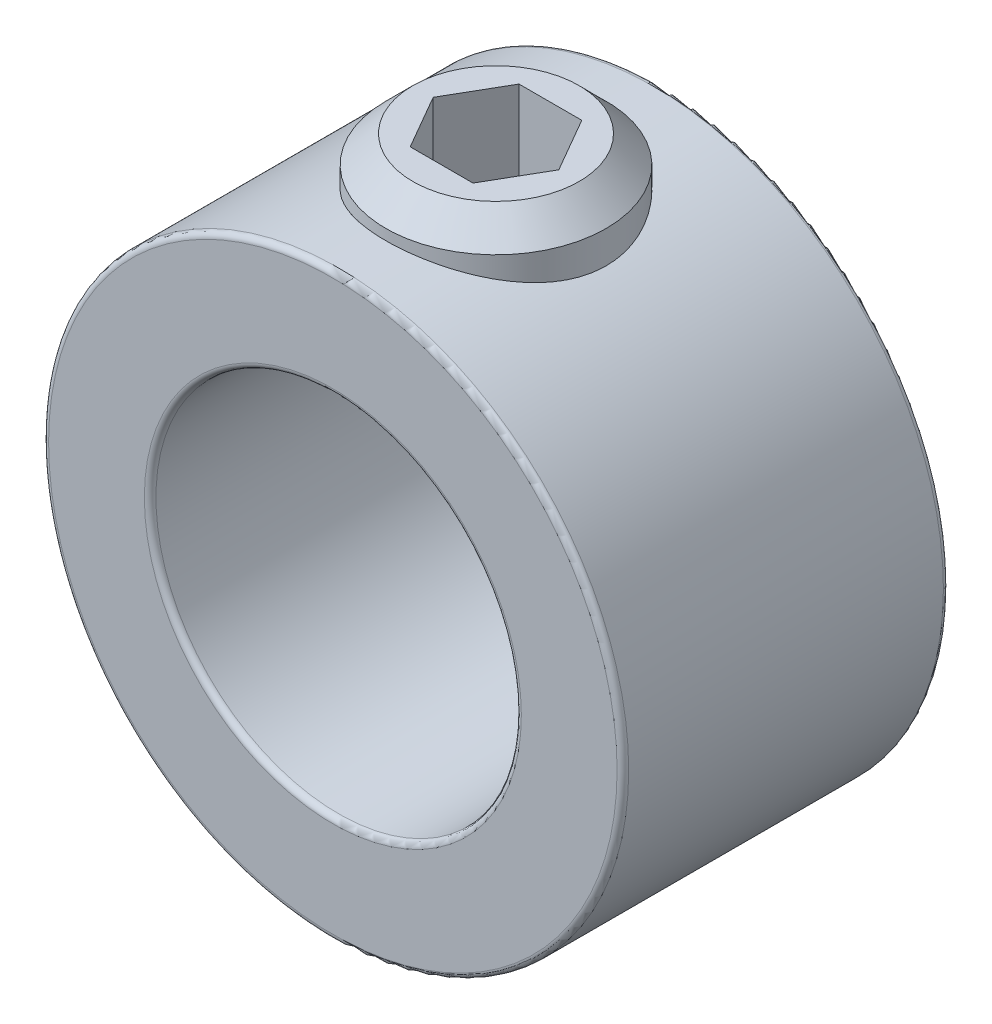
ISO-10303-21;
HEADER;
FILE_DESCRIPTION(('STEP AP214'),'2;1');
FILE_NAME('part.step','',(''),(''),'','','');
FILE_SCHEMA(('AUTOMOTIVE_DESIGN { 1 0 10303 214 1 1 1 1 }'));
ENDSEC;
DATA;
#1=APPLICATION_CONTEXT('core data for automotive mechanical design processes');
#2=APPLICATION_PROTOCOL_DEFINITION('international standard','automotive_design',2000,#1);
#3=PRODUCT_CONTEXT('',#1,'mechanical');
#4=PRODUCT('Part','Part','',(#3));
#5=PRODUCT_RELATED_PRODUCT_CATEGORY('part','',(#4));
#6=PRODUCT_DEFINITION_FORMATION('','',#4);
#7=PRODUCT_DEFINITION_CONTEXT('part definition',#1,'design');
#8=PRODUCT_DEFINITION('design','',#6,#7);
#9=PRODUCT_DEFINITION_SHAPE('','',#8);
#10=(LENGTH_UNIT() NAMED_UNIT(*) SI_UNIT(.MILLI.,.METRE.));
#11=(NAMED_UNIT(*) PLANE_ANGLE_UNIT() SI_UNIT($,.RADIAN.));
#12=(NAMED_UNIT(*) SI_UNIT($,.STERADIAN.) SOLID_ANGLE_UNIT());
#13=UNCERTAINTY_MEASURE_WITH_UNIT(LENGTH_MEASURE(1.E-05),#10,'distance_accuracy_value','');
#14=(GEOMETRIC_REPRESENTATION_CONTEXT(3) GLOBAL_UNCERTAINTY_ASSIGNED_CONTEXT((#13)) GLOBAL_UNIT_ASSIGNED_CONTEXT((#10,
#11,#12)) REPRESENTATION_CONTEXT('',''));
#15=CARTESIAN_POINT('',(0.,0.,0.));
#16=DIRECTION('',(0.,0.,1.));
#17=DIRECTION('',(1.,0.,0.));
#18=AXIS2_PLACEMENT_3D('',#15,#16,#17);
#19=CARTESIAN_POINT('',(0.,7.17499999999999,0.));
#20=DIRECTION('',(0.,1.,0.));
#21=DIRECTION('',(-1.,0.,0.));
#22=AXIS2_PLACEMENT_3D('',#19,#20,#21);
#23=PLANE('',#22);
#24=CARTESIAN_POINT('',(1.18718499478035E-13,7.17499999999997,0.));
#25=DIRECTION('',(0.,1.,0.));
#26=DIRECTION('',(-1.,0.,0.));
#27=AXIS2_PLACEMENT_3D('',#24,#25,#26);
#28=CIRCLE('',#27,1.81975161629035);
#29=CARTESIAN_POINT('',(-1.81975161629023,7.175,0.));
#30=VERTEX_POINT('',#29);
#31=EDGE_CURVE('E12',#30,#30,#28,.T.);
#32=ORIENTED_EDGE('',*,*,#31,.T.);
#33=EDGE_LOOP('',(#32));
#34=FACE_BOUND('',#33,.T.);
#35=DIRECTION('',(1.,0.,0.));
#36=VECTOR('',#35,1.);
#37=CARTESIAN_POINT('',(-0.687407664253899,7.17499999999998,-1.190625));
#38=LINE('',#37,#36);
#39=CARTESIAN_POINT('',(-0.687407664253899,7.17499999999998,-1.190625));
#40=VERTEX_POINT('',#39);
#41=CARTESIAN_POINT('',(0.687407664253899,7.17499999999997,-1.190625));
#42=VERTEX_POINT('',#41);
#43=EDGE_CURVE('E117',#40,#42,#38,.T.);
#44=ORIENTED_EDGE('',*,*,#43,.T.);
#45=DIRECTION('',(0.5,0.,0.866025403784439));
#46=VECTOR('',#45,1.);
#47=CARTESIAN_POINT('',(0.687407664253899,7.17499999999998,-1.190625));
#48=LINE('',#47,#46);
#49=CARTESIAN_POINT('',(1.3748153285078,7.17499999999998,0.));
#50=VERTEX_POINT('',#49);
#51=EDGE_CURVE('E63',#42,#50,#48,.T.);
#52=ORIENTED_EDGE('',*,*,#51,.T.);
#53=DIRECTION('',(-0.499999999999999,0.,0.866025403784439));
#54=VECTOR('',#53,1.);
#55=CARTESIAN_POINT('',(1.3748153285078,7.17499999999998,0.));
#56=LINE('',#55,#54);
#57=CARTESIAN_POINT('',(0.687407664253899,7.17499999999998,1.190625));
#58=VERTEX_POINT('',#57);
#59=EDGE_CURVE('E121',#50,#58,#56,.T.);
#60=ORIENTED_EDGE('',*,*,#59,.T.);
#61=DIRECTION('',(-1.,0.,0.));
#62=VECTOR('',#61,1.);
#63=CARTESIAN_POINT('',(0.687407664253899,7.17499999999998,1.190625));
#64=LINE('',#63,#62);
#65=CARTESIAN_POINT('',(-0.687407664253899,7.17499999999998,1.190625));
#66=VERTEX_POINT('',#65);
#67=EDGE_CURVE('E184',#58,#66,#64,.T.);
#68=ORIENTED_EDGE('',*,*,#67,.T.);
#69=DIRECTION('',(-0.5,0.,-0.866025403784439));
#70=VECTOR('',#69,1.);
#71=CARTESIAN_POINT('',(-0.687407664253899,7.17499999999998,1.190625));
#72=LINE('',#71,#70);
#73=CARTESIAN_POINT('',(-1.3748153285078,7.17499999999998,0.));
#74=VERTEX_POINT('',#73);
#75=EDGE_CURVE('E169',#66,#74,#72,.T.);
#76=ORIENTED_EDGE('',*,*,#75,.T.);
#77=DIRECTION('',(0.5,0.,-0.866025403784439));
#78=VECTOR('',#77,1.);
#79=CARTESIAN_POINT('',(-1.3748153285078,7.17499999999998,0.));
#80=LINE('',#79,#78);
#81=EDGE_CURVE('E165',#74,#40,#80,.T.);
#82=ORIENTED_EDGE('',*,*,#81,.T.);
#83=EDGE_LOOP('',(#44,#52,#60,#68,#76,#82));
#84=FACE_BOUND('',#83,.T.);
#85=ADVANCED_FACE('F49',(#34,#84),#23,.T.);
#86=CARTESIAN_POINT('',(1.18718499478035E-13,7.17499999999997,0.));
#87=DIRECTION('',(0.,-1.,0.));
#88=DIRECTION('',(1.,0.,0.));
#89=AXIS2_PLACEMENT_3D('',#86,#87,#88);
#90=CONICAL_SURFACE('',#89,1.81975161629035,0.785398163397432);
#91=CARTESIAN_POINT('',(1.08902533215764E-13,6.58175161629025,0.));
#92=DIRECTION('',(0.,1.,0.));
#93=DIRECTION('',(-1.,0.,0.));
#94=AXIS2_PLACEMENT_3D('',#91,#92,#93);
#95=CIRCLE('',#94,2.41300000000005);
#96=CARTESIAN_POINT('',(-2.41299999999994,6.58175161629029,0.));
#97=VERTEX_POINT('',#96);
#98=EDGE_CURVE('E56',#97,#97,#95,.T.);
#99=ORIENTED_EDGE('',*,*,#98,.T.);
#100=EDGE_LOOP('',(#99));
#101=FACE_BOUND('',#100,.T.);
#102=ORIENTED_EDGE('',*,*,#31,.F.);
#103=EDGE_LOOP('',(#102));
#104=FACE_BOUND('',#103,.T.);
#105=ADVANCED_FACE('F139',(#101,#104),#90,.T.);
#106=CARTESIAN_POINT('',(0.,4.,0.));
#107=DIRECTION('',(0.,1.,0.));
#108=DIRECTION('',(-1.,0.,0.));
#109=AXIS2_PLACEMENT_3D('',#106,#107,#108);
#110=CYLINDRICAL_SURFACE('',#109,2.41300000000004);
#111=CARTESIAN_POINT('',(0.,4.59324838370967,0.));
#112=DIRECTION('',(0.,1.,0.));
#113=DIRECTION('',(-1.,0.,0.));
#114=AXIS2_PLACEMENT_3D('',#111,#112,#113);
#115=CIRCLE('',#114,2.41300000000002);
#116=CARTESIAN_POINT('',(-2.41299999999994,4.59324838370971,0.));
#117=VERTEX_POINT('',#116);
#118=EDGE_CURVE('E134',#117,#117,#115,.T.);
#119=ORIENTED_EDGE('',*,*,#118,.T.);
#120=EDGE_LOOP('',(#119));
#121=FACE_BOUND('',#120,.T.);
#122=ORIENTED_EDGE('',*,*,#98,.F.);
#123=EDGE_LOOP('',(#122));
#124=FACE_BOUND('',#123,.T.);
#125=ADVANCED_FACE('F142',(#121,#124),#110,.T.);
#126=CARTESIAN_POINT('',(0.,4.59324838370967,0.));
#127=DIRECTION('',(0.,1.,0.));
#128=DIRECTION('',(-1.,0.,0.));
#129=AXIS2_PLACEMENT_3D('',#126,#127,#128);
#130=CONICAL_SURFACE('',#129,2.41300000000002,0.785398163397465);
#131=CARTESIAN_POINT('',(0.,3.99999999999997,0.));
#132=DIRECTION('',(0.,1.,0.));
#133=DIRECTION('',(-1.,0.,0.));
#134=AXIS2_PLACEMENT_3D('',#131,#132,#133);
#135=CIRCLE('',#134,1.8197516162903);
#136=CARTESIAN_POINT('',(-1.81975161629023,4.,0.));
#137=VERTEX_POINT('',#136);
#138=EDGE_CURVE('E126',#137,#137,#135,.T.);
#139=ORIENTED_EDGE('',*,*,#138,.T.);
#140=EDGE_LOOP('',(#139));
#141=FACE_BOUND('',#140,.T.);
#142=ORIENTED_EDGE('',*,*,#118,.F.);
#143=EDGE_LOOP('',(#142));
#144=FACE_BOUND('',#143,.T.);
#145=ADVANCED_FACE('F144',(#141,#144),#130,.T.);
#146=CARTESIAN_POINT('',(-1.81975161629023,4.00000000000001,0.));
#147=DIRECTION('',(0.,-1.,0.));
#148=DIRECTION('',(1.,0.,0.));
#149=AXIS2_PLACEMENT_3D('',#146,#147,#148);
#150=PLANE('',#149);
#151=CARTESIAN_POINT('',(0.,3.99999999999999,0.));
#152=DIRECTION('',(0.,1.,0.));
#153=DIRECTION('',(-1.,0.,0.));
#154=AXIS2_PLACEMENT_3D('',#151,#152,#153);
#155=CIRCLE('',#154,0.711898060452);
#156=CARTESIAN_POINT('',(-0.711898060451934,4.,0.));
#157=VERTEX_POINT('',#156);
#158=EDGE_CURVE('E122',#157,#157,#155,.T.);
#159=ORIENTED_EDGE('',*,*,#158,.T.);
#160=EDGE_LOOP('',(#159));
#161=FACE_BOUND('',#160,.T.);
#162=ORIENTED_EDGE('',*,*,#138,.F.);
#163=EDGE_LOOP('',(#162));
#164=FACE_BOUND('',#163,.T.);
#165=ADVANCED_FACE('F151',(#161,#164),#150,.T.);
#166=CARTESIAN_POINT('',(0.,3.99999999999999,0.));
#167=DIRECTION('',(0.,-1.,0.));
#168=DIRECTION('',(1.,0.,0.));
#169=AXIS2_PLACEMENT_3D('',#166,#167,#168);
#170=CONICAL_SURFACE('',#169,0.711898060452,0.785398163397431);
#171=CARTESIAN_POINT('',(0.,4.711898060452,0.));
#172=VERTEX_POINT('',#171);
#173=VERTEX_LOOP('',#172);
#174=FACE_BOUND('',#173,.T.);
#175=ORIENTED_EDGE('',*,*,#158,.F.);
#176=EDGE_LOOP('',(#175));
#177=FACE_BOUND('',#176,.T.);
#178=ADVANCED_FACE('F218',(#174,#177),#170,.F.);
#179=CARTESIAN_POINT('',(0.687407664253899,4.79374999999998,-1.190625));
#180=DIRECTION('',(-0.866025403784439,0.,0.5));
#181=DIRECTION('',(0.5,0.,0.866025403784439));
#182=AXIS2_PLACEMENT_3D('',#179,#180,#181);
#183=PLANE('',#182);
#184=ORIENTED_EDGE('',*,*,#51,.F.);
#185=DIRECTION('',(0.,1.,0.));
#186=VECTOR('',#185,1.);
#187=CARTESIAN_POINT('',(0.687407664253899,4.79374999999998,-1.190625));
#188=LINE('',#187,#186);
#189=CARTESIAN_POINT('',(0.687407664253899,4.79374999999998,-1.190625));
#190=VERTEX_POINT('',#189);
#191=EDGE_CURVE('E116',#190,#42,#188,.T.);
#192=ORIENTED_EDGE('',*,*,#191,.F.);
#193=DIRECTION('',(0.5,0.,0.866025403784439));
#194=VECTOR('',#193,1.);
#195=CARTESIAN_POINT('',(0.687407664253899,4.79374999999998,-1.190625));
#196=LINE('',#195,#194);
#197=CARTESIAN_POINT('',(1.3748153285078,4.79374999999998,0.));
#198=VERTEX_POINT('',#197);
#199=EDGE_CURVE('E107',#190,#198,#196,.T.);
#200=ORIENTED_EDGE('',*,*,#199,.T.);
#201=DIRECTION('',(0.,1.,0.));
#202=VECTOR('',#201,1.);
#203=CARTESIAN_POINT('',(1.3748153285078,4.79374999999998,0.));
#204=LINE('',#203,#202);
#205=EDGE_CURVE('E115',#198,#50,#204,.T.);
#206=ORIENTED_EDGE('',*,*,#205,.T.);
#207=EDGE_LOOP('',(#184,#192,#200,#206));
#208=FACE_BOUND('',#207,.T.);
#209=ADVANCED_FACE('F114',(#208),#183,.T.);
#210=CARTESIAN_POINT('',(1.3748153285078,4.79374999999998,0.));
#211=DIRECTION('',(-0.866025403784439,0.,-0.499999999999999));
#212=DIRECTION('',(-0.5,0.,0.866025403784439));
#213=AXIS2_PLACEMENT_3D('',#210,#211,#212);
#214=PLANE('',#213);
#215=ORIENTED_EDGE('',*,*,#59,.F.);
#216=ORIENTED_EDGE('',*,*,#205,.F.);
#217=DIRECTION('',(-0.499999999999999,0.,0.866025403784439));
#218=VECTOR('',#217,1.);
#219=CARTESIAN_POINT('',(1.3748153285078,4.79374999999998,0.));
#220=LINE('',#219,#218);
#221=CARTESIAN_POINT('',(0.687407664253899,4.79374999999998,1.190625));
#222=VERTEX_POINT('',#221);
#223=EDGE_CURVE('E103',#198,#222,#220,.T.);
#224=ORIENTED_EDGE('',*,*,#223,.T.);
#225=DIRECTION('',(0.,1.,0.));
#226=VECTOR('',#225,1.);
#227=CARTESIAN_POINT('',(0.687407664253899,4.79374999999998,1.190625));
#228=LINE('',#227,#226);
#229=EDGE_CURVE('E123',#222,#58,#228,.T.);
#230=ORIENTED_EDGE('',*,*,#229,.T.);
#231=EDGE_LOOP('',(#215,#216,#224,#230));
#232=FACE_BOUND('',#231,.T.);
#233=ADVANCED_FACE('F119',(#232),#214,.T.);
#234=CARTESIAN_POINT('',(0.687407664253899,4.79374999999998,1.190625));
#235=DIRECTION('',(0.,0.,-1.));
#236=DIRECTION('',(-1.,0.,0.));
#237=AXIS2_PLACEMENT_3D('',#234,#235,#236);
#238=PLANE('',#237);
#239=ORIENTED_EDGE('',*,*,#67,.F.);
#240=ORIENTED_EDGE('',*,*,#229,.F.);
#241=DIRECTION('',(-1.,0.,0.));
#242=VECTOR('',#241,1.);
#243=CARTESIAN_POINT('',(0.687407664253899,4.79374999999998,1.190625));
#244=LINE('',#243,#242);
#245=CARTESIAN_POINT('',(-0.687407664253899,4.79374999999998,1.190625));
#246=VERTEX_POINT('',#245);
#247=EDGE_CURVE('E109',#222,#246,#244,.T.);
#248=ORIENTED_EDGE('',*,*,#247,.T.);
#249=DIRECTION('',(0.,1.,0.));
#250=VECTOR('',#249,1.);
#251=CARTESIAN_POINT('',(-0.687407664253899,4.79374999999998,1.190625));
#252=LINE('',#251,#250);
#253=EDGE_CURVE('E128',#246,#66,#252,.T.);
#254=ORIENTED_EDGE('',*,*,#253,.T.);
#255=EDGE_LOOP('',(#239,#240,#248,#254));
#256=FACE_BOUND('',#255,.T.);
#257=ADVANCED_FACE('F182',(#256),#238,.T.);
#258=CARTESIAN_POINT('',(-0.687407664253899,4.79374999999998,1.190625));
#259=DIRECTION('',(0.866025403784439,0.,-0.5));
#260=DIRECTION('',(-0.5,0.,-0.866025403784439));
#261=AXIS2_PLACEMENT_3D('',#258,#259,#260);
#262=PLANE('',#261);
#263=ORIENTED_EDGE('',*,*,#75,.F.);
#264=ORIENTED_EDGE('',*,*,#253,.F.);
#265=DIRECTION('',(-0.5,0.,-0.866025403784439));
#266=VECTOR('',#265,1.);
#267=CARTESIAN_POINT('',(-0.687407664253899,4.79374999999998,1.190625));
#268=LINE('',#267,#266);
#269=CARTESIAN_POINT('',(-1.3748153285078,4.79374999999998,0.));
#270=VERTEX_POINT('',#269);
#271=EDGE_CURVE('E195',#246,#270,#268,.T.);
#272=ORIENTED_EDGE('',*,*,#271,.T.);
#273=DIRECTION('',(0.,1.,0.));
#274=VECTOR('',#273,1.);
#275=CARTESIAN_POINT('',(-1.3748153285078,4.79374999999998,0.));
#276=LINE('',#275,#274);
#277=EDGE_CURVE('E177',#270,#74,#276,.T.);
#278=ORIENTED_EDGE('',*,*,#277,.T.);
#279=EDGE_LOOP('',(#263,#264,#272,#278));
#280=FACE_BOUND('',#279,.T.);
#281=ADVANCED_FACE('F186',(#280),#262,.T.);
#282=CARTESIAN_POINT('',(-1.3748153285078,4.79374999999998,0.));
#283=DIRECTION('',(0.866025403784439,0.,0.5));
#284=DIRECTION('',(0.5,0.,-0.866025403784439));
#285=AXIS2_PLACEMENT_3D('',#282,#283,#284);
#286=PLANE('',#285);
#287=ORIENTED_EDGE('',*,*,#81,.F.);
#288=ORIENTED_EDGE('',*,*,#277,.F.);
#289=DIRECTION('',(0.5,0.,-0.866025403784439));
#290=VECTOR('',#289,1.);
#291=CARTESIAN_POINT('',(-1.3748153285078,4.79374999999998,0.));
#292=LINE('',#291,#290);
#293=CARTESIAN_POINT('',(-0.687407664253899,4.79374999999998,-1.190625));
#294=VERTEX_POINT('',#293);
#295=EDGE_CURVE('E193',#270,#294,#292,.T.);
#296=ORIENTED_EDGE('',*,*,#295,.T.);
#297=DIRECTION('',(0.,1.,0.));
#298=VECTOR('',#297,1.);
#299=CARTESIAN_POINT('',(-0.687407664253899,4.79374999999998,-1.190625));
#300=LINE('',#299,#298);
#301=EDGE_CURVE('E174',#294,#40,#300,.T.);
#302=ORIENTED_EDGE('',*,*,#301,.T.);
#303=EDGE_LOOP('',(#287,#288,#296,#302));
#304=FACE_BOUND('',#303,.T.);
#305=ADVANCED_FACE('F199',(#304),#286,.T.);
#306=CARTESIAN_POINT('',(-0.687407664253899,4.79374999999998,-1.190625));
#307=DIRECTION('',(0.,0.,1.));
#308=DIRECTION('',(1.,0.,0.));
#309=AXIS2_PLACEMENT_3D('',#306,#307,#308);
#310=PLANE('',#309);
#311=ORIENTED_EDGE('',*,*,#43,.F.);
#312=ORIENTED_EDGE('',*,*,#301,.F.);
#313=DIRECTION('',(1.,0.,0.));
#314=VECTOR('',#313,1.);
#315=CARTESIAN_POINT('',(-0.687407664253899,4.79374999999998,-1.190625));
#316=LINE('',#315,#314);
#317=EDGE_CURVE('E175',#294,#190,#316,.T.);
#318=ORIENTED_EDGE('',*,*,#317,.T.);
#319=ORIENTED_EDGE('',*,*,#191,.T.);
#320=EDGE_LOOP('',(#311,#312,#318,#319));
#321=FACE_BOUND('',#320,.T.);
#322=ADVANCED_FACE('F200',(#321),#310,.T.);
#323=CARTESIAN_POINT('',(2.06222299276169,4.79374999999998,1.190625));
#324=DIRECTION('',(0.,-1.,0.));
#325=DIRECTION('',(0.,0.,-1.));
#326=AXIS2_PLACEMENT_3D('',#323,#324,#325);
#327=PLANE('',#326);
#328=ORIENTED_EDGE('',*,*,#199,.F.);
#329=ORIENTED_EDGE('',*,*,#317,.F.);
#330=ORIENTED_EDGE('',*,*,#295,.F.);
#331=ORIENTED_EDGE('',*,*,#271,.F.);
#332=ORIENTED_EDGE('',*,*,#247,.F.);
#333=ORIENTED_EDGE('',*,*,#223,.F.);
#334=EDGE_LOOP('',(#328,#329,#330,#331,#332,#333));
#335=FACE_BOUND('',#334,.T.);
#336=ADVANCED_FACE('F105',(#335),#327,.F.);
#337=CLOSED_SHELL('',(#85,#105,#125,#145,#165,#178,#209,#233,#257,#281,#305,#322,#336));
#338=MANIFOLD_SOLID_BREP('B2',#337);
#339=CARTESIAN_POINT('',(0.,0.,3.571875));
#340=DIRECTION('',(0.,0.,1.));
#341=DIRECTION('',(1.,0.,0.));
#342=AXIS2_PLACEMENT_3D('',#339,#340,#341);
#343=PLANE('',#342);
#344=CARTESIAN_POINT('',(0.,0.,3.571875));
#345=DIRECTION('',(0.,0.,1.));
#346=DIRECTION('',(1.,0.,0.));
#347=AXIS2_PLACEMENT_3D('',#344,#345,#346);
#348=CIRCLE('',#347,4.127);
#349=CARTESIAN_POINT('',(4.127,0.,3.571875));
#350=VERTEX_POINT('',#349);
#351=EDGE_CURVE('E317',#350,#350,#348,.F.);
#352=ORIENTED_EDGE('',*,*,#351,.T.);
#353=EDGE_LOOP('',(#352));
#354=FACE_BOUND('',#353,.T.);
#355=CARTESIAN_POINT('',(0.,0.,3.571875));
#356=DIRECTION('',(0.,0.,1.));
#357=DIRECTION('',(1.,0.,0.));
#358=AXIS2_PLACEMENT_3D('',#355,#356,#357);
#359=CIRCLE('',#358,6.223);
#360=CARTESIAN_POINT('',(6.223,0.,3.571875));
#361=VERTEX_POINT('',#360);
#362=EDGE_CURVE('E322',#361,#361,#359,.T.);
#363=ORIENTED_EDGE('',*,*,#362,.T.);
#364=EDGE_LOOP('',(#363));
#365=FACE_BOUND('',#364,.T.);
#366=ADVANCED_FACE('F304',(#354,#365),#343,.T.);
#367=CARTESIAN_POINT('',(0.,0.,-3.571875));
#368=DIRECTION('',(0.,0.,1.));
#369=DIRECTION('',(1.,0.,0.));
#370=AXIS2_PLACEMENT_3D('',#367,#368,#369);
#371=PLANE('',#370);
#372=CARTESIAN_POINT('',(0.,0.,-3.571875));
#373=DIRECTION('',(0.,0.,1.));
#374=DIRECTION('',(1.,0.,0.));
#375=AXIS2_PLACEMENT_3D('',#372,#373,#374);
#376=CIRCLE('',#375,4.127);
#377=CARTESIAN_POINT('',(4.127,0.,-3.571875));
#378=VERTEX_POINT('',#377);
#379=EDGE_CURVE('E336',#378,#378,#376,.T.);
#380=ORIENTED_EDGE('',*,*,#379,.T.);
#381=EDGE_LOOP('',(#380));
#382=FACE_BOUND('',#381,.T.);
#383=CARTESIAN_POINT('',(0.,0.,-3.571875));
#384=DIRECTION('',(0.,0.,1.));
#385=DIRECTION('',(1.,0.,0.));
#386=AXIS2_PLACEMENT_3D('',#383,#384,#385);
#387=CIRCLE('',#386,6.223);
#388=CARTESIAN_POINT('',(6.223,0.,-3.571875));
#389=VERTEX_POINT('',#388);
#390=EDGE_CURVE('E340',#389,#389,#387,.F.);
#391=ORIENTED_EDGE('',*,*,#390,.T.);
#392=EDGE_LOOP('',(#391));
#393=FACE_BOUND('',#392,.T.);
#394=ADVANCED_FACE('F378',(#382,#393),#371,.F.);
#395=CARTESIAN_POINT('',(0.,0.,3.571875));
#396=DIRECTION('',(0.,0.,-1.));
#397=DIRECTION('',(-1.,0.,0.));
#398=AXIS2_PLACEMENT_3D('',#395,#396,#397);
#399=CYLINDRICAL_SURFACE('',#398,6.35);
#400=CARTESIAN_POINT('',(0.,0.,-3.444875));
#401=DIRECTION('',(0.,0.,1.));
#402=DIRECTION('',(1.,0.,0.));
#403=AXIS2_PLACEMENT_3D('',#400,#401,#402);
#404=CIRCLE('',#403,6.35);
#405=CARTESIAN_POINT('',(6.35,0.,-3.444875));
#406=VERTEX_POINT('',#405);
#407=EDGE_CURVE('E48',#406,#406,#404,.T.);
#408=ORIENTED_EDGE('',*,*,#407,.T.);
#409=EDGE_LOOP('',(#408));
#410=FACE_BOUND('',#409,.T.);
#411=CARTESIAN_POINT('',(0.,0.,3.444875));
#412=DIRECTION('',(0.,0.,1.));
#413=DIRECTION('',(1.,0.,0.));
#414=AXIS2_PLACEMENT_3D('',#411,#412,#413);
#415=CIRCLE('',#414,6.35);
#416=CARTESIAN_POINT('',(6.35,0.,3.444875));
#417=VERTEX_POINT('',#416);
#418=EDGE_CURVE('E312',#417,#417,#415,.F.);
#419=ORIENTED_EDGE('',*,*,#418,.T.);
#420=EDGE_LOOP('',(#419));
#421=FACE_BOUND('',#420,.T.);
#422=CARTESIAN_POINT('',(0.,6.35,-2.413));
#423=CARTESIAN_POINT('',(0.130555931467962,6.35000398969011,-2.41300527534602));
#424=CARTESIAN_POINT('',(0.261076241377739,6.34593890816647,-2.4023714543113));
#425=CARTESIAN_POINT('',(0.518209446534913,6.33012963929965,-2.36029479676423));
#426=CARTESIAN_POINT('',(0.644823015088655,6.31838678300935,-2.32885556715778));
#427=CARTESIAN_POINT('',(0.890396734122701,6.28848040494,-2.24644511602075));
#428=CARTESIAN_POINT('',(1.00937135935963,6.27032947705095,-2.19551218938446));
#429=CARTESIAN_POINT('',(1.23707694907279,6.22940932060409,-2.07575764561934));
#430=CARTESIAN_POINT('',(1.34580507871092,6.20663881943741,-2.00693109764769));
#431=CARTESIAN_POINT('',(1.5546544090621,6.15771932779737,-1.85022277092613));
#432=CARTESIAN_POINT('',(1.65427192875035,6.13147296383124,-1.76170041624995));
#433=CARTESIAN_POINT('',(1.83765571561736,6.07903240405007,-1.56947315042905));
#434=CARTESIAN_POINT('',(1.92141693988139,6.05283822744466,-1.46576342765122));
#435=CARTESIAN_POINT('',(2.07395660623911,6.00232668170519,-1.24113386470124));
#436=CARTESIAN_POINT('',(2.14201618015845,5.97812365120729,-1.11969756154783));
#437=CARTESIAN_POINT('',(2.25652093858858,5.93585432476053,-0.866038380432351));
#438=CARTESIAN_POINT('',(2.30297502037546,5.91778550353544,-0.733819969020803));
#439=CARTESIAN_POINT('',(2.37094947712185,5.89087364983883,-0.46815363189803));
#440=CARTESIAN_POINT('',(2.39343294050412,5.88167580744491,-0.334989300795486));
#441=CARTESIAN_POINT('',(2.41583880524757,5.87251090464605,-0.0664845962936197));
#442=CARTESIAN_POINT('',(2.41577084821779,5.87253989940926,0.0688548224232351));
#443=CARTESIAN_POINT('',(2.39381090108878,5.88152011871453,0.328972227003014));
#444=CARTESIAN_POINT('',(2.37326609797153,5.88992057372023,0.453886522563246));
#445=CARTESIAN_POINT('',(2.31316652422954,5.91378008823147,0.698339704990829));
#446=CARTESIAN_POINT('',(2.27360881167116,5.92924024008996,0.817877756841903));
#447=CARTESIAN_POINT('',(2.17588364092748,5.96580146890692,1.0508916152852));
#448=CARTESIAN_POINT('',(2.11737290423754,5.98700531598431,1.16420661484106));
#449=CARTESIAN_POINT('',(1.98364217411328,6.03263175509447,1.37979639920587));
#450=CARTESIAN_POINT('',(1.90841630395244,6.05705547794376,1.4820672822727));
#451=CARTESIAN_POINT('',(1.73726689770536,6.10842961274997,1.68010694238863));
#452=CARTESIAN_POINT('',(1.64027173491613,6.13543795015635,1.77493688260015));
#453=CARTESIAN_POINT('',(1.43144868882472,6.18748920351012,1.94726806056401));
#454=CARTESIAN_POINT('',(1.31961840653187,6.2125318005324,2.02476649017818));
#455=CARTESIAN_POINT('',(1.08185265975391,6.25835188225341,2.16130771487283));
#456=CARTESIAN_POINT('',(0.955717417234618,6.27905339803369,2.22002994310971));
#457=CARTESIAN_POINT('',(0.694375189035109,6.31329326294077,2.31510736575226));
#458=CARTESIAN_POINT('',(0.559172376611221,6.32683488218724,2.3514727723643));
#459=CARTESIAN_POINT('',(0.291428150212525,6.3446501972992,2.39898109857718));
#460=CARTESIAN_POINT('',(0.159141645079808,6.34938771868047,2.41138775288999));
#461=CARTESIAN_POINT('',(-0.105693065348276,6.35049981057155,2.41431626348443));
#462=CARTESIAN_POINT('',(-0.238241203822052,6.34687629478166,2.40484312768025));
#463=CARTESIAN_POINT('',(-0.494323602805378,6.33197908606406,2.36523562382545));
#464=CARTESIAN_POINT('',(-0.61800684441211,6.32101461634214,2.33593589818825));
#465=CARTESIAN_POINT('',(-0.858609565436108,6.29285092848222,2.25861304376362));
#466=CARTESIAN_POINT('',(-0.975528163914414,6.27565090041604,2.21058748264173));
#467=CARTESIAN_POINT('',(-1.20317276582384,6.23607457125026,2.09563503714011));
#468=CARTESIAN_POINT('',(-1.3136121499673,6.21355984396609,2.02818967610491));
#469=CARTESIAN_POINT('',(-1.52197988578177,6.16583504517286,1.87689595883598));
#470=CARTESIAN_POINT('',(-1.61990351002366,6.14062396176678,1.79304143465584));
#471=CARTESIAN_POINT('',(-1.80656807112922,6.08841217199752,1.60543272496061));
#472=CARTESIAN_POINT('',(-1.89441393314817,6.06139435477813,1.5007904098217));
#473=CARTESIAN_POINT('',(-2.05148411432654,6.01005496187559,1.27772800811267));
#474=CARTESIAN_POINT('',(-2.12070651399853,5.98573366426972,1.15930650314625));
#475=CARTESIAN_POINT('',(-2.23870023772464,5.94261798623815,0.910922748538602));
#476=CARTESIAN_POINT('',(-2.28736466342468,5.92385264334907,0.780904332023381));
#477=CARTESIAN_POINT('',(-2.36177800946808,5.89458517077402,0.513602694331982));
#478=CARTESIAN_POINT('',(-2.38754162954713,5.8840777409413,0.376324193363579));
#479=CARTESIAN_POINT('',(-2.41408994040532,5.87323215610138,0.108127165215383));
#480=CARTESIAN_POINT('',(-2.41640623148607,5.87227054588007,-0.0226157343841075));
#481=CARTESIAN_POINT('',(-2.3999373204655,5.8790202253426,-0.282524873396556));
#482=CARTESIAN_POINT('',(-2.38115423316032,5.88673064582666,-0.41169126951125));
#483=CARTESIAN_POINT('',(-2.32422421188573,5.90943043237583,-0.660552265849344));
#484=CARTESIAN_POINT('',(-2.28672002796391,5.92417751295514,-0.780417919491674));
#485=CARTESIAN_POINT('',(-2.19398528189399,5.95914188552999,-1.01222145618602));
#486=CARTESIAN_POINT('',(-2.13875018285588,5.97936057736356,-1.12415730124382));
#487=CARTESIAN_POINT('',(-2.00869997639504,6.02433337271119,-1.34342800575803));
#488=CARTESIAN_POINT('',(-1.93299650808671,6.04927206356278,-1.4501976241717));
#489=CARTESIAN_POINT('',(-1.76551836882645,6.10025417003155,-1.65000619367226));
#490=CARTESIAN_POINT('',(-1.67373852090438,6.12629793945648,-1.74304070389426));
#491=CARTESIAN_POINT('',(-1.47055494697206,6.17831294001547,-1.91807209951937));
#492=CARTESIAN_POINT('',(-1.35833856072122,6.20419794006484,-1.99915556641372));
#493=CARTESIAN_POINT('',(-1.12096041375387,6.25144642675378,-2.14129762074769));
#494=CARTESIAN_POINT('',(-0.995797050693124,6.27280935273315,-2.20235372565052));
#495=CARTESIAN_POINT('',(-0.728778395788011,6.30955475572144,-2.30499263616226));
#496=CARTESIAN_POINT('',(-0.58638469778337,6.32454657619379,-2.3453288052365));
#497=CARTESIAN_POINT('',(-0.295976705251577,6.34476431329028,-2.39932232882264));
#498=CARTESIAN_POINT('',(-0.147965475024477,6.34999547828747,-2.41299402119021));
#499=CARTESIAN_POINT('',(0.,6.35,-2.413));
#500=B_SPLINE_CURVE_WITH_KNOTS('',3,(#422,#423,#424,#425,#426,#427,#428,#429,#430,#431,#432,
#433,#434,#435,#436,#437,#438,#439,#440,#441,#442,#443,#444,#445,#446,#447,#448,#449,#450,#451,
#452,#453,#454,#455,#456,#457,#458,#459,#460,#461,#462,#463,#464,#465,#466,#467,#468,#469,#470,
#471,#472,#473,#474,#475,#476,#477,#478,#479,#480,#481,#482,#483,#484,#485,#486,#487,#488,#489,
#490,#491,#492,#493,#494,#495,#496,#497,#498,#499),.UNSPECIFIED.,.T.,.F.,(4,2,2,2,2,2,2,2,2,2,2,
2,2,2,2,2,2,2,2,2,2,2,2,2,2,2,2,2,2,2,2,2,2,2,2,2,2,2,4),(0.,0.391121887064184,
0.782175985486185,1.17246577830223,1.56286323524963,1.96854634212709,2.37435825594016,
2.79613130529395,3.21773051175688,3.62166628723491,4.02542936468621,4.40427313209371,
4.78317553819666,5.16936515238192,5.55569075901495,5.96873424705112,6.38184461005431,
6.80167192308661,7.22130732355892,7.61812936188612,8.01486058335588,8.39585156202364,
8.77689204483065,9.16923685274999,9.56172942118012,9.9776135359701,10.3935404987953,
10.8116043631128,11.2293996833676,11.6197130905881,12.0099873800853,12.3876994067832,
12.7655081575183,13.1635000328781,13.5616203073395,13.9821012344605,14.4026342635628,
14.8461505355472,15.2894282569131),.UNSPECIFIED.);
#501=CARTESIAN_POINT('',(0.,6.35,-2.413));
#502=VERTEX_POINT('',#501);
#503=EDGE_CURVE('E344',#502,#502,#500,.T.);
#504=ORIENTED_EDGE('',*,*,#503,.T.);
#505=EDGE_LOOP('',(#504));
#506=FACE_BOUND('',#505,.T.);
#507=ADVANCED_FACE('F374',(#410,#421,#506),#399,.T.);
#508=CARTESIAN_POINT('',(0.,0.,3.571875));
#509=DIRECTION('',(0.,0.,-1.));
#510=DIRECTION('',(-1.,0.,0.));
#511=AXIS2_PLACEMENT_3D('',#508,#509,#510);
#512=CYLINDRICAL_SURFACE('',#511,4.);
#513=CARTESIAN_POINT('',(0.,0.,-3.444875));
#514=DIRECTION('',(0.,0.,1.));
#515=DIRECTION('',(1.,0.,0.));
#516=AXIS2_PLACEMENT_3D('',#513,#514,#515);
#517=CIRCLE('',#516,4.);
#518=CARTESIAN_POINT('',(4.,0.,-3.444875));
#519=VERTEX_POINT('',#518);
#520=EDGE_CURVE('E328',#519,#519,#517,.F.);
#521=ORIENTED_EDGE('',*,*,#520,.T.);
#522=EDGE_LOOP('',(#521));
#523=FACE_BOUND('',#522,.T.);
#524=CARTESIAN_POINT('',(0.,0.,3.444875));
#525=DIRECTION('',(0.,0.,1.));
#526=DIRECTION('',(1.,0.,0.));
#527=AXIS2_PLACEMENT_3D('',#524,#525,#526);
#528=CIRCLE('',#527,4.);
#529=CARTESIAN_POINT('',(4.,0.,3.444875));
#530=VERTEX_POINT('',#529);
#531=EDGE_CURVE('E332',#530,#530,#528,.T.);
#532=ORIENTED_EDGE('',*,*,#531,.T.);
#533=EDGE_LOOP('',(#532));
#534=FACE_BOUND('',#533,.T.);
#535=CARTESIAN_POINT('',(0.,4.,-2.413));
#536=CARTESIAN_POINT('',(0.123322909545414,3.99999257547968,-2.41299181286447));
#537=CARTESIAN_POINT('',(0.246840956413378,3.99423445454943,-2.40347922897274));
#538=CARTESIAN_POINT('',(0.49015013606743,3.97174599179964,-2.36591490691551));
#539=CARTESIAN_POINT('',(0.609931614634151,3.95498935447447,-2.33781873744261));
#540=CARTESIAN_POINT('',(0.841733058460955,3.91220010528617,-2.26467472176439));
#541=CARTESIAN_POINT('',(0.953788297168411,3.88621351716021,-2.21971092201106));
#542=CARTESIAN_POINT('',(1.16840655298053,3.82717024158209,-2.11463620414993));
#543=CARTESIAN_POINT('',(1.27097174576874,3.79411518042743,-2.0545287696878));
#544=CARTESIAN_POINT('',(1.47262930333117,3.72071788469523,-1.91573723605489));
#545=CARTESIAN_POINT('',(1.57084758193897,3.68001068457079,-1.83597980329481));
#546=CARTESIAN_POINT('',(1.7533662236864,3.59663707667864,-1.66257398776147));
#547=CARTESIAN_POINT('',(1.83764833334605,3.55396819149448,-1.56890768714194));
#548=CARTESIAN_POINT('',(2.00052958955652,3.46518447946615,-1.35665439328807));
#549=CARTESIAN_POINT('',(2.07712137804172,3.41930024547421,-1.23641702418345));
#550=CARTESIAN_POINT('',(2.20873249669036,3.33580571167875,-0.982080847332024));
#551=CARTESIAN_POINT('',(2.26378705258018,3.29818194588001,-0.848005131103428));
#552=CARTESIAN_POINT('',(2.33901351601737,3.24508818848604,-0.603120747553829));
#553=CARTESIAN_POINT('',(2.3644174177827,3.22645342294222,-0.494608623284401));
#554=CARTESIAN_POINT('',(2.40000398867193,3.20007663708871,-0.273873481299344));
#555=CARTESIAN_POINT('',(2.41020590260117,3.19232084538164,-0.161655339553763));
#556=CARTESIAN_POINT('',(2.41479633841015,3.18885094262704,0.0635256937233431));
#557=CARTESIAN_POINT('',(2.4091525980984,3.19316139874159,0.176489636820421));
#558=CARTESIAN_POINT('',(2.38234558239354,3.21320614941702,0.399549609787198));
#559=CARTESIAN_POINT('',(2.36117052610395,3.22894911573645,0.509643396889759));
#560=CARTESIAN_POINT('',(2.30484441620844,3.26938185112098,0.722664408458122));
#561=CARTESIAN_POINT('',(2.26989462240649,3.29394234786451,0.825670790486037));
#562=CARTESIAN_POINT('',(2.18731240135941,3.34934791831531,1.02462149940366));
#563=CARTESIAN_POINT('',(2.1396753481738,3.38019528333181,1.12056323411078));
#564=CARTESIAN_POINT('',(2.0233899275176,3.45127646551586,1.32064885061418));
#565=CARTESIAN_POINT('',(1.95251731620366,3.49220611665326,1.42325314906302));
#566=CARTESIAN_POINT('',(1.7960928209783,3.57517827035065,1.61618727016155));
#567=CARTESIAN_POINT('',(1.71052674872601,3.61722181501213,1.70650507619285));
#568=CARTESIAN_POINT('',(1.51268968051129,3.7047371285458,1.88535618006352));
#569=CARTESIAN_POINT('',(1.39835072633665,3.74984355215335,1.97180078185445));
#570=CARTESIAN_POINT('',(1.15394269115952,3.8320954083922,2.12405985957826));
#571=CARTESIAN_POINT('',(1.02388183321063,3.86924497476894,2.18988505596335));
#572=CARTESIAN_POINT('',(0.823956633258982,3.91476998223666,2.26900987186047));
#573=CARTESIAN_POINT('',(0.758752263251475,3.92795629342521,2.29165107453216));
#574=CARTESIAN_POINT('',(0.626151677995811,3.95125947263615,2.33136926761451));
#575=CARTESIAN_POINT('',(0.558756718255467,3.96137806569618,2.34844938553237));
#576=CARTESIAN_POINT('',(0.422383095374718,3.97822927278868,2.37676390870311));
#577=CARTESIAN_POINT('',(0.353405664407441,3.98496443358805,2.38800271103469));
#578=CARTESIAN_POINT('',(0.214507552708434,3.99485226698304,2.40446539794539));
#579=CARTESIAN_POINT('',(0.144587009553452,3.99800545650122,2.40969015042742));
#580=CARTESIAN_POINT('',(-0.0462667003762131,4.00154739421155,2.41557068577173));
#581=CARTESIAN_POINT('',(-0.167528560148124,3.99828861195493,2.41019102084374));
#582=CARTESIAN_POINT('',(-0.407036595614223,3.98105189216437,2.38148414350138));
#583=CARTESIAN_POINT('',(-0.525282848321121,3.96707422865351,2.35815738989572));
#584=CARTESIAN_POINT('',(-0.752575286525097,3.93020931925896,2.29558992396275));
#585=CARTESIAN_POINT('',(-0.861781047801816,3.90756414970317,2.25678048215327));
#586=CARTESIAN_POINT('',(-1.07209119689194,3.85517622656414,2.16480454446263));
#587=CARTESIAN_POINT('',(-1.17319401730183,3.82543210419038,2.1116352795196));
#588=CARTESIAN_POINT('',(-1.37575994077182,3.75763743503971,1.98632127054713));
#589=CARTESIAN_POINT('',(-1.47617661812216,3.71904572918355,1.91278186495509));
#590=CARTESIAN_POINT('',(-1.66399828320879,3.63889567080427,1.75185694942391));
#591=CARTESIAN_POINT('',(-1.75138793998611,3.59733390668587,1.66445537136356));
#592=CARTESIAN_POINT('',(-1.92259218463819,3.50914266015815,1.46482804353419));
#593=CARTESIAN_POINT('',(-2.00440282819373,3.46257048748855,1.35084778501632));
#594=CARTESIAN_POINT('',(-2.1478056570699,3.37549683188662,1.10871331045023));
#595=CARTESIAN_POINT('',(-2.20941831293158,3.33498922532258,0.980573622165581));
#596=CARTESIAN_POINT('',(-2.29900138452086,3.27366537880559,0.741455065234548));
#597=CARTESIAN_POINT('',(-2.33136125669876,3.25048656185499,0.632733509745717));
#598=CARTESIAN_POINT('',(-2.38059394376511,3.21461035401447,0.410221085471721));
#599=CARTESIAN_POINT('',(-2.3974886354383,3.20189815978485,0.296437617016594));
#600=CARTESIAN_POINT('',(-2.41485040276495,3.18882895804827,0.0664247810941981));
#601=CARTESIAN_POINT('',(-2.41525191195016,3.18852126307952,-0.0498125109482632));
#602=CARTESIAN_POINT('',(-2.3994293368401,3.20044144305786,-0.280521387962857));
#603=CARTESIAN_POINT('',(-2.38319652581374,3.21267589789459,-0.394992014107085));
#604=CARTESIAN_POINT('',(-2.33637341511978,3.24686469807411,-0.612960682792152));
#605=CARTESIAN_POINT('',(-2.30657526323231,3.26827938661011,-0.716719673146554));
#606=CARTESIAN_POINT('',(-2.23418549716664,3.31818337652375,-0.917834616770459));
#607=CARTESIAN_POINT('',(-2.1915890398341,3.34667535539195,-1.01518812903839));
#608=CARTESIAN_POINT('',(-2.08734232630969,3.4128231656662,-1.21669074683162));
#609=CARTESIAN_POINT('',(-2.02377480175355,3.45121403646451,-1.31960376657258));
#610=CARTESIAN_POINT('',(-1.88251864148961,3.53025225282439,-1.51432417113276));
#611=CARTESIAN_POINT('',(-1.80481833252533,3.57090144426902,-1.60612227017335));
#612=CARTESIAN_POINT('',(-1.62222121331238,3.65790515673536,-1.79183063780888));
#613=CARTESIAN_POINT('',(-1.51494860953724,3.70407236738184,-1.88351017949941));
#614=CARTESIAN_POINT('',(-1.28419078024235,3.79024672334247,-2.04778663369039));
#615=CARTESIAN_POINT('',(-1.16069929501955,3.83025147722668,-2.12037614571972));
#616=CARTESIAN_POINT('',(-0.967311847950819,3.88183429777555,-2.21174207266786));
#617=CARTESIAN_POINT('',(-0.902401254841146,3.89747056660979,-2.23902673792759));
#618=CARTESIAN_POINT('',(-0.769887244314888,3.92579289507565,-2.28797306178537));
#619=CARTESIAN_POINT('',(-0.702285422554305,3.93848067325864,-2.30963799674829));
#620=CARTESIAN_POINT('',(-0.565128657760934,3.96048518125553,-2.34696350833041));
#621=CARTESIAN_POINT('',(-0.495580003341265,3.96981165912459,-2.36264145572746));
#622=CARTESIAN_POINT('',(-0.355025804056634,3.98483916738286,-2.38780544642597));
#623=CARTESIAN_POINT('',(-0.284021504606006,3.99054317355828,-2.39729657224424));
#624=CARTESIAN_POINT('',(-0.177336605819426,3.9962238328715,-2.40673624627638));
#625=CARTESIAN_POINT('',(-0.141926792443642,3.99763813382974,-2.40908332015337));
#626=CARTESIAN_POINT('',(-0.0710167167545751,3.99952730538919,-2.41221640731885));
#627=CARTESIAN_POINT('',(-0.0355164508630174,4.00000213822891,-2.41300235785871));
#628=CARTESIAN_POINT('',(0.,4.,-2.413));
#629=B_SPLINE_CURVE_WITH_KNOTS('',3,(#535,#536,#537,#538,#539,#540,#541,#542,#543,#544,#545,
#546,#547,#548,#549,#550,#551,#552,#553,#554,#555,#556,#557,#558,#559,#560,#561,#562,#563,#564,
#565,#566,#567,#568,#569,#570,#571,#572,#573,#574,#575,#576,#577,#578,#579,#580,#581,#582,#583,
#584,#585,#586,#587,#588,#589,#590,#591,#592,#593,#594,#595,#596,#597,#598,#599,#600,#601,#602,
#603,#604,#605,#606,#607,#608,#609,#610,#611,#612,#613,#614,#615,#616,#617,#618,#619,#620,#621,
#622,#623,#624,#625,#626,#627,#628),.UNSPECIFIED.,.T.,.F.,(4,2,2,2,2,2,2,2,2,2,2,2,2,2,2,2,2,2,
2,2,2,2,2,2,2,2,2,2,2,2,2,2,2,2,2,2,2,2,2,2,2,2,2,2,2,2,4),(0.,0.369824557755499,
0.74053653706132,1.10942538602124,1.47822945305289,1.87540403910439,2.27309478961254,
2.72020007092044,3.16657099033039,3.50411881922853,3.84123896869875,4.17904600159873,
4.51710953502285,4.85040664104968,5.18382543831957,5.57607266085674,5.96870079830313,
6.41728397512725,6.86563353574567,7.076184586289,7.28661701933574,7.4968908180863,
7.70713426788179,8.06940025943124,8.43165699013225,8.78445827508726,9.13732764075294,
9.52673058623921,9.91658824602676,10.3580438745212,10.7990506970823,11.1449669259402,
11.4903930679049,11.8371922735254,12.1841735108457,12.5130757259581,12.8421025618479,
13.221425593335,13.6010633689138,14.0444097154269,14.4879276777811,14.7040378130406,
14.9200216690706,15.1353740153363,15.350549224451,15.4570527756914,15.5635606077064),.UNSPECIFIED.);
#630=CARTESIAN_POINT('',(0.,4.,-2.413));
#631=VERTEX_POINT('',#630);
#632=EDGE_CURVE('E345',#631,#631,#629,.T.);
#633=ORIENTED_EDGE('',*,*,#632,.F.);
#634=EDGE_LOOP('',(#633));
#635=FACE_BOUND('',#634,.T.);
#636=ADVANCED_FACE('F358',(#523,#534,#635),#512,.F.);
#637=CARTESIAN_POINT('',(0.,6.35,0.));
#638=DIRECTION('',(0.,-1.,0.));
#639=DIRECTION('',(0.,0.,-1.));
#640=AXIS2_PLACEMENT_3D('',#637,#638,#639);
#641=CYLINDRICAL_SURFACE('',#640,2.413);
#642=ORIENTED_EDGE('',*,*,#632,.T.);
#643=EDGE_LOOP('',(#642));
#644=FACE_BOUND('',#643,.T.);
#645=ORIENTED_EDGE('',*,*,#503,.F.);
#646=EDGE_LOOP('',(#645));
#647=FACE_BOUND('',#646,.T.);
#648=ADVANCED_FACE('F361',(#644,#647),#641,.F.);
#649=CARTESIAN_POINT('',(0.,0.,-3.444875));
#650=DIRECTION('',(0.,0.,1.));
#651=DIRECTION('',(1.,0.,0.));
#652=AXIS2_PLACEMENT_3D('',#649,#650,#651);
#653=TOROIDAL_SURFACE('',#652,4.127,0.127);
#654=ORIENTED_EDGE('',*,*,#520,.F.);
#655=EDGE_LOOP('',(#654));
#656=FACE_BOUND('',#655,.T.);
#657=ORIENTED_EDGE('',*,*,#379,.F.);
#658=EDGE_LOOP('',(#657));
#659=FACE_BOUND('',#658,.T.);
#660=ADVANCED_FACE('F364',(#656,#659),#653,.T.);
#661=CARTESIAN_POINT('',(0.,0.,3.444875));
#662=DIRECTION('',(0.,0.,1.));
#663=DIRECTION('',(1.,0.,0.));
#664=AXIS2_PLACEMENT_3D('',#661,#662,#663);
#665=TOROIDAL_SURFACE('',#664,4.127,0.127);
#666=ORIENTED_EDGE('',*,*,#351,.F.);
#667=EDGE_LOOP('',(#666));
#668=FACE_BOUND('',#667,.T.);
#669=ORIENTED_EDGE('',*,*,#531,.F.);
#670=EDGE_LOOP('',(#669));
#671=FACE_BOUND('',#670,.T.);
#672=ADVANCED_FACE('F371',(#668,#671),#665,.T.);
#673=CARTESIAN_POINT('',(0.,0.,-3.444875));
#674=DIRECTION('',(0.,0.,1.));
#675=DIRECTION('',(1.,0.,0.));
#676=AXIS2_PLACEMENT_3D('',#673,#674,#675);
#677=TOROIDAL_SURFACE('',#676,6.223,0.127);
#678=ORIENTED_EDGE('',*,*,#390,.F.);
#679=EDGE_LOOP('',(#678));
#680=FACE_BOUND('',#679,.T.);
#681=ORIENTED_EDGE('',*,*,#407,.F.);
#682=EDGE_LOOP('',(#681));
#683=FACE_BOUND('',#682,.T.);
#684=ADVANCED_FACE('F390',(#680,#683),#677,.T.);
#685=CARTESIAN_POINT('',(0.,0.,3.444875));
#686=DIRECTION('',(0.,0.,1.));
#687=DIRECTION('',(1.,0.,0.));
#688=AXIS2_PLACEMENT_3D('',#685,#686,#687);
#689=TOROIDAL_SURFACE('',#688,6.223,0.127);
#690=ORIENTED_EDGE('',*,*,#418,.F.);
#691=EDGE_LOOP('',(#690));
#692=FACE_BOUND('',#691,.T.);
#693=ORIENTED_EDGE('',*,*,#362,.F.);
#694=EDGE_LOOP('',(#693));
#695=FACE_BOUND('',#694,.T.);
#696=ADVANCED_FACE('F306',(#692,#695),#689,.T.);
#697=CLOSED_SHELL('',(#366,#394,#507,#636,#648,#660,#672,#684,#696));
#698=MANIFOLD_SOLID_BREP('B6',#697);
#699=ADVANCED_BREP_SHAPE_REPRESENTATION('',(#18,#338,#698),#14);
#700=SHAPE_DEFINITION_REPRESENTATION(#9,#699);
ENDSEC;
END-ISO-10303-21;
